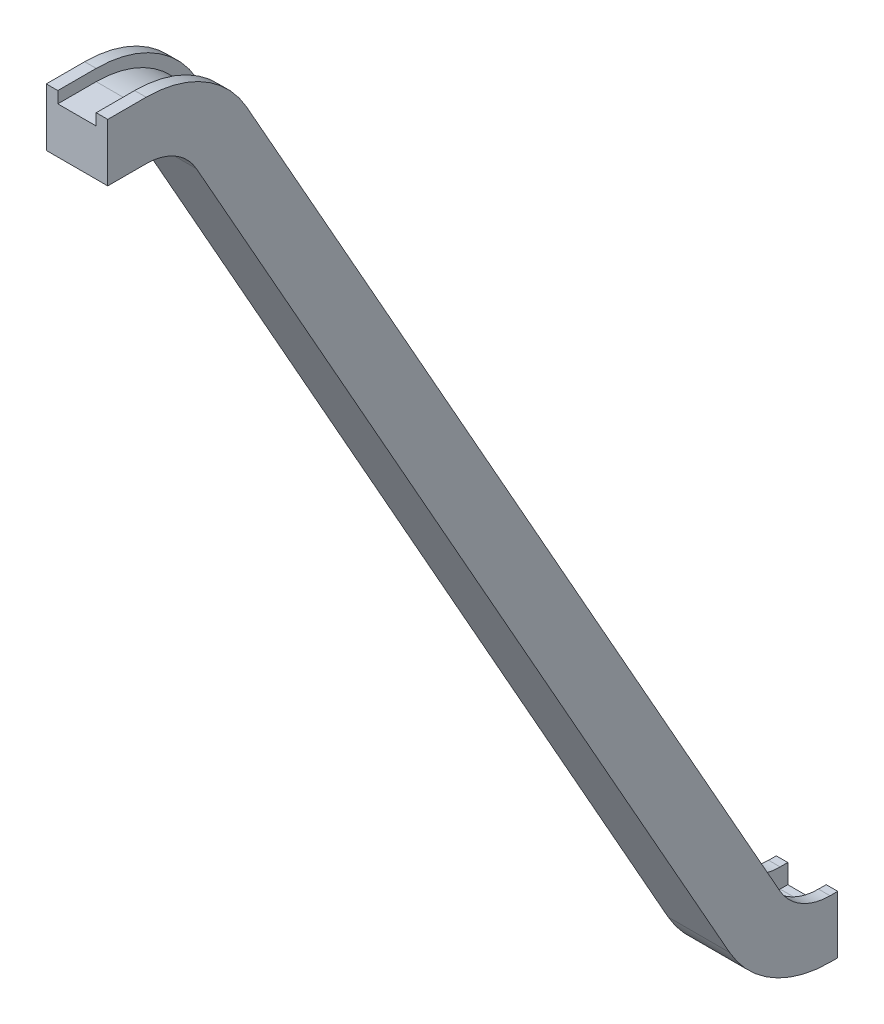
ISO-10303-21;
HEADER;
FILE_DESCRIPTION(('STEP AP214'),'2;1');
FILE_NAME('part.step','',(''),(''),'','','');
FILE_SCHEMA(('AUTOMOTIVE_DESIGN { 1 0 10303 214 1 1 1 1 }'));
ENDSEC;
DATA;
#1=APPLICATION_CONTEXT('core data for automotive mechanical design processes');
#2=APPLICATION_PROTOCOL_DEFINITION('international standard','automotive_design',2000,#1);
#3=PRODUCT_CONTEXT('',#1,'mechanical');
#4=PRODUCT('Part','Part','',(#3));
#5=PRODUCT_RELATED_PRODUCT_CATEGORY('part','',(#4));
#6=PRODUCT_DEFINITION_FORMATION('','',#4);
#7=PRODUCT_DEFINITION_CONTEXT('part definition',#1,'design');
#8=PRODUCT_DEFINITION('design','',#6,#7);
#9=PRODUCT_DEFINITION_SHAPE('','',#8);
#10=(LENGTH_UNIT() NAMED_UNIT(*) SI_UNIT(.MILLI.,.METRE.));
#11=(NAMED_UNIT(*) PLANE_ANGLE_UNIT() SI_UNIT($,.RADIAN.));
#12=(NAMED_UNIT(*) SI_UNIT($,.STERADIAN.) SOLID_ANGLE_UNIT());
#13=UNCERTAINTY_MEASURE_WITH_UNIT(LENGTH_MEASURE(1.E-05),#10,'distance_accuracy_value','');
#14=(GEOMETRIC_REPRESENTATION_CONTEXT(3) GLOBAL_UNCERTAINTY_ASSIGNED_CONTEXT((#13)) GLOBAL_UNIT_ASSIGNED_CONTEXT((#10,
#11,#12)) REPRESENTATION_CONTEXT('',''));
#15=CARTESIAN_POINT('',(0.,0.,0.));
#16=DIRECTION('',(0.,0.,1.));
#17=DIRECTION('',(1.,0.,0.));
#18=AXIS2_PLACEMENT_3D('',#15,#16,#17);
#19=CARTESIAN_POINT('',(16.,15.3965664492848,-27.2988300579903));
#20=DIRECTION('',(0.,0.491254052119881,-0.871016335251985));
#21=DIRECTION('',(0.,0.871016335251985,0.491254052119881));
#22=AXIS2_PLACEMENT_3D('',#19,#20,#21);
#23=PLANE('',#22);
#24=DIRECTION('',(-1.,0.,0.));
#25=VECTOR('',#24,1.);
#26=CARTESIAN_POINT('',(16.,-0.262378436403575,-36.1304900575595));
#27=LINE('',#26,#25);
#28=CARTESIAN_POINT('',(3.,-0.262378436403572,-36.1304900575595));
#29=VERTEX_POINT('',#28);
#30=CARTESIAN_POINT('',(0.,-0.262378436403575,-36.1304900575595));
#31=VERTEX_POINT('',#30);
#32=EDGE_CURVE('E56',#29,#31,#27,.T.);
#33=ORIENTED_EDGE('',*,*,#32,.F.);
#34=DIRECTION('',(0.,0.871016335251985,0.491254052119881));
#35=VECTOR('',#34,1.);
#36=CARTESIAN_POINT('',(3.,15.3965664492848,-27.2988300579903));
#37=LINE('',#36,#35);
#38=CARTESIAN_POINT('',(3.,-246.368810781798,-174.93475497122));
#39=VERTEX_POINT('',#38);
#40=EDGE_CURVE('E326',#39,#29,#37,.T.);
#41=ORIENTED_EDGE('',*,*,#40,.F.);
#42=DIRECTION('',(-1.,0.,0.));
#43=VECTOR('',#42,1.);
#44=CARTESIAN_POINT('',(16.,-246.368810781798,-174.93475497122));
#45=LINE('',#44,#43);
#46=CARTESIAN_POINT('',(0.,-246.368810781798,-174.93475497122));
#47=VERTEX_POINT('',#46);
#48=EDGE_CURVE('E118',#39,#47,#45,.T.);
#49=ORIENTED_EDGE('',*,*,#48,.T.);
#50=DIRECTION('',(0.,-0.871016335251985,-0.491254052119881));
#51=VECTOR('',#50,1.);
#52=CARTESIAN_POINT('',(0.,15.3965664492848,-27.2988300579903));
#53=LINE('',#52,#51);
#54=EDGE_CURVE('E194',#31,#47,#53,.T.);
#55=ORIENTED_EDGE('',*,*,#54,.F.);
#56=EDGE_LOOP('',(#33,#41,#49,#55));
#57=FACE_BOUND('',#56,.T.);
#58=ADVANCED_FACE('F47',(#57),#23,.T.);
#59=CARTESIAN_POINT('',(16.,-15.,-10.));
#60=DIRECTION('',(-1.,0.,0.));
#61=DIRECTION('',(0.,0.,1.));
#62=AXIS2_PLACEMENT_3D('',#59,#60,#61);
#63=CYLINDRICAL_SURFACE('',#62,30.);
#64=CARTESIAN_POINT('',(3.,-15.,-10.));
#65=DIRECTION('',(1.,0.,0.));
#66=DIRECTION('',(0.,0.,-1.));
#67=AXIS2_PLACEMENT_3D('',#64,#65,#66);
#68=CIRCLE('',#67,30.);
#69=CARTESIAN_POINT('',(3.,15.,-10.));
#70=VERTEX_POINT('',#69);
#71=EDGE_CURVE('E467',#29,#70,#68,.T.);
#72=ORIENTED_EDGE('',*,*,#71,.F.);
#73=ORIENTED_EDGE('',*,*,#32,.T.);
#74=CARTESIAN_POINT('',(0.,-15.,-10.));
#75=DIRECTION('',(1.,0.,0.));
#76=DIRECTION('',(0.,0.,-1.));
#77=AXIS2_PLACEMENT_3D('',#74,#75,#76);
#78=CIRCLE('',#77,30.);
#79=CARTESIAN_POINT('',(0.,15.,-10.));
#80=VERTEX_POINT('',#79);
#81=EDGE_CURVE('E197',#31,#80,#78,.T.);
#82=ORIENTED_EDGE('',*,*,#81,.T.);
#83=DIRECTION('',(-1.,0.,0.));
#84=VECTOR('',#83,1.);
#85=CARTESIAN_POINT('',(16.,15.,-10.));
#86=LINE('',#85,#84);
#87=EDGE_CURVE('E268',#70,#80,#86,.T.);
#88=ORIENTED_EDGE('',*,*,#87,.F.);
#89=EDGE_LOOP('',(#72,#73,#82,#88));
#90=FACE_BOUND('',#89,.T.);
#91=ADVANCED_FACE('F291',(#90),#63,.T.);
#92=CARTESIAN_POINT('',(16.,15.,0.));
#93=DIRECTION('',(0.,1.,0.));
#94=DIRECTION('',(0.,0.,1.));
#95=AXIS2_PLACEMENT_3D('',#92,#93,#94);
#96=PLANE('',#95);
#97=DIRECTION('',(-1.,0.,0.));
#98=VECTOR('',#97,1.);
#99=CARTESIAN_POINT('',(16.,15.,0.));
#100=LINE('',#99,#98);
#101=CARTESIAN_POINT('',(3.,15.,0.));
#102=VERTEX_POINT('',#101);
#103=CARTESIAN_POINT('',(0.,15.,0.));
#104=VERTEX_POINT('',#103);
#105=EDGE_CURVE('E264',#102,#104,#100,.T.);
#106=ORIENTED_EDGE('',*,*,#105,.F.);
#107=DIRECTION('',(0.,0.,1.));
#108=VECTOR('',#107,1.);
#109=CARTESIAN_POINT('',(3.,15.,0.));
#110=LINE('',#109,#108);
#111=EDGE_CURVE('E287',#70,#102,#110,.T.);
#112=ORIENTED_EDGE('',*,*,#111,.F.);
#113=ORIENTED_EDGE('',*,*,#87,.T.);
#114=DIRECTION('',(0.,0.,-1.));
#115=VECTOR('',#114,1.);
#116=CARTESIAN_POINT('',(0.,15.,0.));
#117=LINE('',#116,#115);
#118=EDGE_CURVE('E202',#104,#80,#117,.T.);
#119=ORIENTED_EDGE('',*,*,#118,.F.);
#120=EDGE_LOOP('',(#106,#112,#113,#119));
#121=FACE_BOUND('',#120,.T.);
#122=ADVANCED_FACE('F284',(#121),#96,.T.);
#123=CARTESIAN_POINT('',(16.,0.,0.));
#124=DIRECTION('',(0.,0.,1.));
#125=DIRECTION('',(0.,-1.,0.));
#126=AXIS2_PLACEMENT_3D('',#123,#124,#125);
#127=PLANE('',#126);
#128=DIRECTION('',(1.,0.,0.));
#129=VECTOR('',#128,1.);
#130=CARTESIAN_POINT('',(3.,12.,0.));
#131=LINE('',#130,#129);
#132=CARTESIAN_POINT('',(3.,12.,0.));
#133=VERTEX_POINT('',#132);
#134=CARTESIAN_POINT('',(13.,12.,0.));
#135=VERTEX_POINT('',#134);
#136=EDGE_CURVE('E411',#133,#135,#131,.T.);
#137=ORIENTED_EDGE('',*,*,#136,.F.);
#138=DIRECTION('',(0.,-1.,0.));
#139=VECTOR('',#138,1.);
#140=CARTESIAN_POINT('',(3.,0.,0.));
#141=LINE('',#140,#139);
#142=EDGE_CURVE('E305',#102,#133,#141,.T.);
#143=ORIENTED_EDGE('',*,*,#142,.F.);
#144=ORIENTED_EDGE('',*,*,#105,.T.);
#145=DIRECTION('',(0.,1.,0.));
#146=VECTOR('',#145,1.);
#147=CARTESIAN_POINT('',(0.,0.,0.));
#148=LINE('',#147,#146);
#149=CARTESIAN_POINT('',(0.,0.,0.));
#150=VERTEX_POINT('',#149);
#151=EDGE_CURVE('E206',#150,#104,#148,.T.);
#152=ORIENTED_EDGE('',*,*,#151,.F.);
#153=DIRECTION('',(-1.,0.,0.));
#154=VECTOR('',#153,1.);
#155=CARTESIAN_POINT('',(16.,0.,0.));
#156=LINE('',#155,#154);
#157=CARTESIAN_POINT('',(16.,0.,0.));
#158=VERTEX_POINT('',#157);
#159=EDGE_CURVE('E261',#158,#150,#156,.T.);
#160=ORIENTED_EDGE('',*,*,#159,.F.);
#161=DIRECTION('',(0.,1.,0.));
#162=VECTOR('',#161,1.);
#163=CARTESIAN_POINT('',(16.,0.,0.));
#164=LINE('',#163,#162);
#165=CARTESIAN_POINT('',(16.,15.,0.));
#166=VERTEX_POINT('',#165);
#167=EDGE_CURVE('E422',#158,#166,#164,.T.);
#168=ORIENTED_EDGE('',*,*,#167,.T.);
#169=CARTESIAN_POINT('',(13.,15.,0.));
#170=VERTEX_POINT('',#169);
#171=EDGE_CURVE('E265',#166,#170,#100,.T.);
#172=ORIENTED_EDGE('',*,*,#171,.T.);
#173=DIRECTION('',(0.,-1.,0.));
#174=VECTOR('',#173,1.);
#175=CARTESIAN_POINT('',(13.,0.,0.));
#176=LINE('',#175,#174);
#177=EDGE_CURVE('E482',#170,#135,#176,.T.);
#178=ORIENTED_EDGE('',*,*,#177,.T.);
#179=EDGE_LOOP('',(#137,#143,#144,#152,#160,#168,#172,#178));
#180=FACE_BOUND('',#179,.T.);
#181=ADVANCED_FACE('F299',(#180),#127,.T.);
#182=CARTESIAN_POINT('',(16.,0.,-190.));
#183=DIRECTION('',(0.,0.,1.));
#184=DIRECTION('',(1.,0.,0.));
#185=AXIS2_PLACEMENT_3D('',#182,#183,#184);
#186=PLANE('',#185);
#187=DIRECTION('',(0.,1.,0.));
#188=VECTOR('',#187,1.);
#189=CARTESIAN_POINT('',(3.,0.,-190.));
#190=LINE('',#189,#188);
#191=CARTESIAN_POINT('',(3.,-259.,-190.));
#192=VERTEX_POINT('',#191);
#193=CARTESIAN_POINT('',(3.,-254.,-190.));
#194=VERTEX_POINT('',#193);
#195=EDGE_CURVE('E443',#192,#194,#190,.T.);
#196=ORIENTED_EDGE('',*,*,#195,.F.);
#197=DIRECTION('',(1.,0.,0.));
#198=VECTOR('',#197,1.);
#199=CARTESIAN_POINT('',(3.,-259.,-190.));
#200=LINE('',#199,#198);
#201=CARTESIAN_POINT('',(13.,-259.,-190.));
#202=VERTEX_POINT('',#201);
#203=EDGE_CURVE('E198',#192,#202,#200,.T.);
#204=ORIENTED_EDGE('',*,*,#203,.T.);
#205=DIRECTION('',(0.,1.,0.));
#206=VECTOR('',#205,1.);
#207=CARTESIAN_POINT('',(13.,0.,-190.));
#208=LINE('',#207,#206);
#209=CARTESIAN_POINT('',(13.,-254.,-190.));
#210=VERTEX_POINT('',#209);
#211=EDGE_CURVE('E177',#202,#210,#208,.T.);
#212=ORIENTED_EDGE('',*,*,#211,.T.);
#213=DIRECTION('',(-1.,0.,0.));
#214=VECTOR('',#213,1.);
#215=CARTESIAN_POINT('',(16.,-254.,-190.));
#216=LINE('',#215,#214);
#217=CARTESIAN_POINT('',(16.,-254.,-190.));
#218=VERTEX_POINT('',#217);
#219=EDGE_CURVE('E171',#218,#210,#216,.T.);
#220=ORIENTED_EDGE('',*,*,#219,.F.);
#221=DIRECTION('',(0.,1.,0.));
#222=VECTOR('',#221,1.);
#223=CARTESIAN_POINT('',(16.,0.,-190.));
#224=LINE('',#223,#222);
#225=CARTESIAN_POINT('',(16.,-269.,-190.));
#226=VERTEX_POINT('',#225);
#227=EDGE_CURVE('E154',#226,#218,#224,.T.);
#228=ORIENTED_EDGE('',*,*,#227,.F.);
#229=DIRECTION('',(-1.,0.,0.));
#230=VECTOR('',#229,1.);
#231=CARTESIAN_POINT('',(16.,-269.,-190.));
#232=LINE('',#231,#230);
#233=CARTESIAN_POINT('',(0.,-269.,-190.));
#234=VERTEX_POINT('',#233);
#235=EDGE_CURVE('E181',#226,#234,#232,.T.);
#236=ORIENTED_EDGE('',*,*,#235,.T.);
#237=DIRECTION('',(0.,1.,0.));
#238=VECTOR('',#237,1.);
#239=CARTESIAN_POINT('',(0.,0.,-190.));
#240=LINE('',#239,#238);
#241=CARTESIAN_POINT('',(0.,-254.,-190.));
#242=VERTEX_POINT('',#241);
#243=EDGE_CURVE('E227',#234,#242,#240,.T.);
#244=ORIENTED_EDGE('',*,*,#243,.T.);
#245=EDGE_CURVE('E182',#194,#242,#216,.T.);
#246=ORIENTED_EDGE('',*,*,#245,.F.);
#247=EDGE_LOOP('',(#196,#204,#212,#220,#228,#236,#244,#246));
#248=FACE_BOUND('',#247,.T.);
#249=ADVANCED_FACE('F173',(#248),#186,.F.);
#250=CARTESIAN_POINT('',(16.,-254.000000000005,-7.04991620636979E-12));
#251=DIRECTION('',(0.,-1.,0.));
#252=DIRECTION('',(0.,0.,-1.));
#253=AXIS2_PLACEMENT_3D('',#250,#251,#252);
#254=PLANE('',#253);
#255=DIRECTION('',(0.,0.,1.));
#256=VECTOR('',#255,1.);
#257=CARTESIAN_POINT('',(3.,-254.000000000005,-7.04991620636979E-12));
#258=LINE('',#257,#256);
#259=CARTESIAN_POINT('',(3.,-254.,-188.));
#260=VERTEX_POINT('',#259);
#261=EDGE_CURVE('E440',#194,#260,#258,.T.);
#262=ORIENTED_EDGE('',*,*,#261,.F.);
#263=ORIENTED_EDGE('',*,*,#245,.T.);
#264=DIRECTION('',(0.,0.,1.));
#265=VECTOR('',#264,1.);
#266=CARTESIAN_POINT('',(0.,-254.000000000005,-7.04991620636979E-12));
#267=LINE('',#266,#265);
#268=CARTESIAN_POINT('',(0.,-254.,-188.));
#269=VERTEX_POINT('',#268);
#270=EDGE_CURVE('E231',#242,#269,#267,.T.);
#271=ORIENTED_EDGE('',*,*,#270,.T.);
#272=DIRECTION('',(-1.,0.,0.));
#273=VECTOR('',#272,1.);
#274=CARTESIAN_POINT('',(16.,-254.,-188.));
#275=LINE('',#274,#273);
#276=EDGE_CURVE('E242',#260,#269,#275,.T.);
#277=ORIENTED_EDGE('',*,*,#276,.F.);
#278=EDGE_LOOP('',(#262,#263,#271,#277));
#279=FACE_BOUND('',#278,.T.);
#280=ADVANCED_FACE('F321',(#279),#254,.F.);
#281=CARTESIAN_POINT('',(16.,-239.,-188.));
#282=DIRECTION('',(-1.,0.,0.));
#283=DIRECTION('',(0.,0.,1.));
#284=AXIS2_PLACEMENT_3D('',#281,#282,#283);
#285=CYLINDRICAL_SURFACE('',#284,15.0000000000001);
#286=ORIENTED_EDGE('',*,*,#48,.F.);
#287=CARTESIAN_POINT('',(3.,-239.,-188.));
#288=DIRECTION('',(1.,0.,0.));
#289=DIRECTION('',(0.,0.,-1.));
#290=AXIS2_PLACEMENT_3D('',#287,#288,#289);
#291=CIRCLE('',#290,15.0000000000001);
#292=EDGE_CURVE('E317',#260,#39,#291,.F.);
#293=ORIENTED_EDGE('',*,*,#292,.F.);
#294=ORIENTED_EDGE('',*,*,#276,.T.);
#295=CARTESIAN_POINT('',(0.,-239.,-188.));
#296=DIRECTION('',(1.,0.,0.));
#297=DIRECTION('',(0.,0.,-1.));
#298=AXIS2_PLACEMENT_3D('',#295,#296,#297);
#299=CIRCLE('',#298,15.0000000000001);
#300=EDGE_CURVE('E235',#47,#269,#299,.T.);
#301=ORIENTED_EDGE('',*,*,#300,.F.);
#302=EDGE_LOOP('',(#286,#293,#294,#301));
#303=FACE_BOUND('',#302,.T.);
#304=ADVANCED_FACE('F314',(#303),#285,.F.);
#305=DIRECTION('',(0.,0.871016335251985,0.491254052119881));
#306=VECTOR('',#305,1.);
#307=CARTESIAN_POINT('',(13.,15.3965664492848,-27.2988300579903));
#308=LINE('',#307,#306);
#309=CARTESIAN_POINT('',(13.,-246.368810781798,-174.93475497122));
#310=VERTEX_POINT('',#309);
#311=CARTESIAN_POINT('',(13.,-0.262378436403572,-36.1304900575595));
#312=VERTEX_POINT('',#311);
#313=EDGE_CURVE('E63',#310,#312,#308,.T.);
#314=ORIENTED_EDGE('',*,*,#313,.T.);
#315=CARTESIAN_POINT('',(16.,-0.262378436403575,-36.1304900575595));
#316=VERTEX_POINT('',#315);
#317=EDGE_CURVE('E11',#316,#312,#27,.T.);
#318=ORIENTED_EDGE('',*,*,#317,.F.);
#319=DIRECTION('',(0.,-0.871016335251985,-0.491254052119881));
#320=VECTOR('',#319,1.);
#321=CARTESIAN_POINT('',(16.,15.3965664492848,-27.2988300579903));
#322=LINE('',#321,#320);
#323=CARTESIAN_POINT('',(16.,-246.368810781798,-174.93475497122));
#324=VERTEX_POINT('',#323);
#325=EDGE_CURVE('E239',#316,#324,#322,.T.);
#326=ORIENTED_EDGE('',*,*,#325,.T.);
#327=EDGE_CURVE('E71',#324,#310,#45,.T.);
#328=ORIENTED_EDGE('',*,*,#327,.T.);
#329=EDGE_LOOP('',(#314,#318,#326,#328));
#330=FACE_BOUND('',#329,.T.);
#331=ADVANCED_FACE('F49',(#330),#23,.T.);
#332=ORIENTED_EDGE('',*,*,#317,.T.);
#333=CARTESIAN_POINT('',(13.,-15.,-10.));
#334=DIRECTION('',(1.,0.,0.));
#335=DIRECTION('',(0.,0.,-1.));
#336=AXIS2_PLACEMENT_3D('',#333,#334,#335);
#337=CIRCLE('',#336,30.);
#338=CARTESIAN_POINT('',(13.,15.,-10.));
#339=VERTEX_POINT('',#338);
#340=EDGE_CURVE('E475',#312,#339,#337,.T.);
#341=ORIENTED_EDGE('',*,*,#340,.T.);
#342=CARTESIAN_POINT('',(16.,15.,-10.));
#343=VERTEX_POINT('',#342);
#344=EDGE_CURVE('E269',#343,#339,#86,.T.);
#345=ORIENTED_EDGE('',*,*,#344,.F.);
#346=CARTESIAN_POINT('',(16.,-15.,-10.));
#347=DIRECTION('',(1.,0.,0.));
#348=DIRECTION('',(0.,0.,-1.));
#349=AXIS2_PLACEMENT_3D('',#346,#347,#348);
#350=CIRCLE('',#349,30.);
#351=EDGE_CURVE('E416',#316,#343,#350,.T.);
#352=ORIENTED_EDGE('',*,*,#351,.F.);
#353=EDGE_LOOP('',(#332,#341,#345,#352));
#354=FACE_BOUND('',#353,.T.);
#355=ADVANCED_FACE('F526',(#354),#63,.T.);
#356=DIRECTION('',(0.,0.,1.));
#357=VECTOR('',#356,1.);
#358=CARTESIAN_POINT('',(13.,15.,0.));
#359=LINE('',#358,#357);
#360=EDGE_CURVE('E479',#339,#170,#359,.T.);
#361=ORIENTED_EDGE('',*,*,#360,.T.);
#362=ORIENTED_EDGE('',*,*,#171,.F.);
#363=DIRECTION('',(0.,0.,-1.));
#364=VECTOR('',#363,1.);
#365=CARTESIAN_POINT('',(16.,15.,0.));
#366=LINE('',#365,#364);
#367=EDGE_CURVE('E419',#166,#343,#366,.T.);
#368=ORIENTED_EDGE('',*,*,#367,.T.);
#369=ORIENTED_EDGE('',*,*,#344,.T.);
#370=EDGE_LOOP('',(#361,#362,#368,#369));
#371=FACE_BOUND('',#370,.T.);
#372=ADVANCED_FACE('F524',(#371),#96,.T.);
#373=CARTESIAN_POINT('',(16.,0.,0.));
#374=DIRECTION('',(0.,1.,0.));
#375=DIRECTION('',(0.,0.,1.));
#376=AXIS2_PLACEMENT_3D('',#373,#374,#375);
#377=PLANE('',#376);
#378=DIRECTION('',(0.,0.,-1.));
#379=VECTOR('',#378,1.);
#380=CARTESIAN_POINT('',(0.,0.,0.));
#381=LINE('',#380,#379);
#382=CARTESIAN_POINT('',(0.,0.,-10.));
#383=VERTEX_POINT('',#382);
#384=EDGE_CURVE('E210',#150,#383,#381,.T.);
#385=ORIENTED_EDGE('',*,*,#384,.T.);
#386=DIRECTION('',(-1.,0.,0.));
#387=VECTOR('',#386,1.);
#388=CARTESIAN_POINT('',(16.,0.,-10.));
#389=LINE('',#388,#387);
#390=CARTESIAN_POINT('',(16.,0.,-10.));
#391=VERTEX_POINT('',#390);
#392=EDGE_CURVE('E258',#391,#383,#389,.T.);
#393=ORIENTED_EDGE('',*,*,#392,.F.);
#394=DIRECTION('',(0.,0.,-1.));
#395=VECTOR('',#394,1.);
#396=CARTESIAN_POINT('',(16.,0.,0.));
#397=LINE('',#396,#395);
#398=EDGE_CURVE('E425',#158,#391,#397,.T.);
#399=ORIENTED_EDGE('',*,*,#398,.F.);
#400=ORIENTED_EDGE('',*,*,#159,.T.);
#401=EDGE_LOOP('',(#385,#393,#399,#400));
#402=FACE_BOUND('',#401,.T.);
#403=ADVANCED_FACE('F552',(#402),#377,.F.);
#404=CARTESIAN_POINT('',(16.,-15.,-10.));
#405=DIRECTION('',(-1.,0.,0.));
#406=DIRECTION('',(0.,0.,1.));
#407=AXIS2_PLACEMENT_3D('',#404,#405,#406);
#408=CYLINDRICAL_SURFACE('',#407,15.);
#409=CARTESIAN_POINT('',(0.,-15.,-10.));
#410=DIRECTION('',(1.,0.,0.));
#411=DIRECTION('',(0.,0.,-1.));
#412=AXIS2_PLACEMENT_3D('',#409,#410,#411);
#413=CIRCLE('',#412,15.);
#414=CARTESIAN_POINT('',(0.,-7.63118921820179,-23.0652450287798));
#415=VERTEX_POINT('',#414);
#416=EDGE_CURVE('E214',#415,#383,#413,.T.);
#417=ORIENTED_EDGE('',*,*,#416,.F.);
#418=DIRECTION('',(-1.,0.,0.));
#419=VECTOR('',#418,1.);
#420=CARTESIAN_POINT('',(16.,-7.63118921820179,-23.0652450287798));
#421=LINE('',#420,#419);
#422=CARTESIAN_POINT('',(16.,-7.63118921820179,-23.0652450287798));
#423=VERTEX_POINT('',#422);
#424=EDGE_CURVE('E255',#423,#415,#421,.T.);
#425=ORIENTED_EDGE('',*,*,#424,.F.);
#426=CARTESIAN_POINT('',(16.,-15.,-10.));
#427=DIRECTION('',(1.,0.,0.));
#428=DIRECTION('',(0.,0.,-1.));
#429=AXIS2_PLACEMENT_3D('',#426,#427,#428);
#430=CIRCLE('',#429,15.);
#431=EDGE_CURVE('E428',#423,#391,#430,.T.);
#432=ORIENTED_EDGE('',*,*,#431,.T.);
#433=ORIENTED_EDGE('',*,*,#392,.T.);
#434=EDGE_LOOP('',(#417,#425,#432,#433));
#435=FACE_BOUND('',#434,.T.);
#436=ADVANCED_FACE('F559',(#435),#408,.F.);
#437=CARTESIAN_POINT('',(16.,8.02775566748663,-14.2335850292106));
#438=DIRECTION('',(0.,0.491254052119881,-0.871016335251985));
#439=DIRECTION('',(0.,0.871016335251985,0.491254052119881));
#440=AXIS2_PLACEMENT_3D('',#437,#438,#439);
#441=PLANE('',#440);
#442=DIRECTION('',(0.,-0.871016335251985,-0.491254052119881));
#443=VECTOR('',#442,1.);
#444=CARTESIAN_POINT('',(0.,8.02775566748663,-14.2335850292106));
#445=LINE('',#444,#443);
#446=CARTESIAN_POINT('',(0.,-253.737621563596,-161.86950994244));
#447=VERTEX_POINT('',#446);
#448=EDGE_CURVE('E218',#415,#447,#445,.T.);
#449=ORIENTED_EDGE('',*,*,#448,.T.);
#450=DIRECTION('',(-1.,0.,0.));
#451=VECTOR('',#450,1.);
#452=CARTESIAN_POINT('',(16.,-253.737621563596,-161.86950994244));
#453=LINE('',#452,#451);
#454=CARTESIAN_POINT('',(16.,-253.737621563596,-161.86950994244));
#455=VERTEX_POINT('',#454);
#456=EDGE_CURVE('E251',#455,#447,#453,.T.);
#457=ORIENTED_EDGE('',*,*,#456,.F.);
#458=DIRECTION('',(0.,-0.871016335251985,-0.491254052119881));
#459=VECTOR('',#458,1.);
#460=CARTESIAN_POINT('',(16.,8.02775566748663,-14.2335850292106));
#461=LINE('',#460,#459);
#462=EDGE_CURVE('E432',#423,#455,#461,.T.);
#463=ORIENTED_EDGE('',*,*,#462,.F.);
#464=ORIENTED_EDGE('',*,*,#424,.T.);
#465=EDGE_LOOP('',(#449,#457,#463,#464));
#466=FACE_BOUND('',#465,.T.);
#467=ADVANCED_FACE('F563',(#466),#441,.F.);
#468=CARTESIAN_POINT('',(16.,-239.,-188.));
#469=DIRECTION('',(-1.,0.,0.));
#470=DIRECTION('',(0.,0.,1.));
#471=AXIS2_PLACEMENT_3D('',#468,#469,#470);
#472=CYLINDRICAL_SURFACE('',#471,30.);
#473=CARTESIAN_POINT('',(0.,-239.,-188.));
#474=DIRECTION('',(1.,0.,0.));
#475=DIRECTION('',(0.,0.,-1.));
#476=AXIS2_PLACEMENT_3D('',#473,#474,#475);
#477=CIRCLE('',#476,30.);
#478=CARTESIAN_POINT('',(0.,-269.,-188.));
#479=VERTEX_POINT('',#478);
#480=EDGE_CURVE('E221',#447,#479,#477,.T.);
#481=ORIENTED_EDGE('',*,*,#480,.T.);
#482=DIRECTION('',(-1.,0.,0.));
#483=VECTOR('',#482,1.);
#484=CARTESIAN_POINT('',(16.,-269.,-188.));
#485=LINE('',#484,#483);
#486=CARTESIAN_POINT('',(16.,-269.,-188.));
#487=VERTEX_POINT('',#486);
#488=EDGE_CURVE('E247',#487,#479,#485,.T.);
#489=ORIENTED_EDGE('',*,*,#488,.F.);
#490=CARTESIAN_POINT('',(16.,-239.,-188.));
#491=DIRECTION('',(1.,0.,0.));
#492=DIRECTION('',(0.,0.,-1.));
#493=AXIS2_PLACEMENT_3D('',#490,#491,#492);
#494=CIRCLE('',#493,30.);
#495=EDGE_CURVE('E435',#455,#487,#494,.T.);
#496=ORIENTED_EDGE('',*,*,#495,.F.);
#497=ORIENTED_EDGE('',*,*,#456,.T.);
#498=EDGE_LOOP('',(#481,#489,#496,#497));
#499=FACE_BOUND('',#498,.T.);
#500=ADVANCED_FACE('F567',(#499),#472,.T.);
#501=CARTESIAN_POINT('',(16.,-269.,0.));
#502=DIRECTION('',(0.,1.,0.));
#503=DIRECTION('',(0.,0.,1.));
#504=AXIS2_PLACEMENT_3D('',#501,#502,#503);
#505=PLANE('',#504);
#506=DIRECTION('',(0.,0.,-1.));
#507=VECTOR('',#506,1.);
#508=CARTESIAN_POINT('',(0.,-269.,0.));
#509=LINE('',#508,#507);
#510=EDGE_CURVE('E224',#479,#234,#509,.T.);
#511=ORIENTED_EDGE('',*,*,#510,.T.);
#512=ORIENTED_EDGE('',*,*,#235,.F.);
#513=DIRECTION('',(0.,0.,-1.));
#514=VECTOR('',#513,1.);
#515=CARTESIAN_POINT('',(16.,-269.,0.));
#516=LINE('',#515,#514);
#517=EDGE_CURVE('E163',#487,#226,#516,.T.);
#518=ORIENTED_EDGE('',*,*,#517,.F.);
#519=ORIENTED_EDGE('',*,*,#488,.T.);
#520=EDGE_LOOP('',(#511,#512,#518,#519));
#521=FACE_BOUND('',#520,.T.);
#522=ADVANCED_FACE('F536',(#521),#505,.F.);
#523=ORIENTED_EDGE('',*,*,#219,.T.);
#524=DIRECTION('',(0.,0.,1.));
#525=VECTOR('',#524,1.);
#526=CARTESIAN_POINT('',(13.,-254.000000000005,-7.04991620636979E-12));
#527=LINE('',#526,#525);
#528=CARTESIAN_POINT('',(13.,-254.,-188.));
#529=VERTEX_POINT('',#528);
#530=EDGE_CURVE('E381',#210,#529,#527,.T.);
#531=ORIENTED_EDGE('',*,*,#530,.T.);
#532=CARTESIAN_POINT('',(16.,-254.,-188.));
#533=VERTEX_POINT('',#532);
#534=EDGE_CURVE('E186',#533,#529,#275,.T.);
#535=ORIENTED_EDGE('',*,*,#534,.F.);
#536=DIRECTION('',(0.,0.,1.));
#537=VECTOR('',#536,1.);
#538=CARTESIAN_POINT('',(16.,-254.000000000005,-7.04991620636979E-12));
#539=LINE('',#538,#537);
#540=EDGE_CURVE('E160',#218,#533,#539,.T.);
#541=ORIENTED_EDGE('',*,*,#540,.F.);
#542=EDGE_LOOP('',(#523,#531,#535,#541));
#543=FACE_BOUND('',#542,.T.);
#544=ADVANCED_FACE('F184',(#543),#254,.F.);
#545=CARTESIAN_POINT('',(13.,-239.,-188.));
#546=DIRECTION('',(1.,0.,0.));
#547=DIRECTION('',(0.,0.,-1.));
#548=AXIS2_PLACEMENT_3D('',#545,#546,#547);
#549=CIRCLE('',#548,15.0000000000001);
#550=EDGE_CURVE('E385',#529,#310,#549,.F.);
#551=ORIENTED_EDGE('',*,*,#550,.T.);
#552=ORIENTED_EDGE('',*,*,#327,.F.);
#553=CARTESIAN_POINT('',(16.,-239.,-188.));
#554=DIRECTION('',(1.,0.,0.));
#555=DIRECTION('',(0.,0.,-1.));
#556=AXIS2_PLACEMENT_3D('',#553,#554,#555);
#557=CIRCLE('',#556,15.0000000000001);
#558=EDGE_CURVE('E188',#324,#533,#557,.T.);
#559=ORIENTED_EDGE('',*,*,#558,.T.);
#560=ORIENTED_EDGE('',*,*,#534,.T.);
#561=EDGE_LOOP('',(#551,#552,#559,#560));
#562=FACE_BOUND('',#561,.T.);
#563=ADVANCED_FACE('F527',(#562),#285,.F.);
#564=CARTESIAN_POINT('',(16.,0.,0.));
#565=DIRECTION('',(1.,0.,0.));
#566=DIRECTION('',(0.,0.,-1.));
#567=AXIS2_PLACEMENT_3D('',#564,#565,#566);
#568=PLANE('',#567);
#569=ORIENTED_EDGE('',*,*,#325,.F.);
#570=ORIENTED_EDGE('',*,*,#351,.T.);
#571=ORIENTED_EDGE('',*,*,#367,.F.);
#572=ORIENTED_EDGE('',*,*,#167,.F.);
#573=ORIENTED_EDGE('',*,*,#398,.T.);
#574=ORIENTED_EDGE('',*,*,#431,.F.);
#575=ORIENTED_EDGE('',*,*,#462,.T.);
#576=ORIENTED_EDGE('',*,*,#495,.T.);
#577=ORIENTED_EDGE('',*,*,#517,.T.);
#578=ORIENTED_EDGE('',*,*,#227,.T.);
#579=ORIENTED_EDGE('',*,*,#540,.T.);
#580=ORIENTED_EDGE('',*,*,#558,.F.);
#581=EDGE_LOOP('',(#569,#570,#571,#572,#573,#574,#575,#576,#577,#578,#579,#580));
#582=FACE_BOUND('',#581,.T.);
#583=ADVANCED_FACE('F157',(#582),#568,.T.);
#584=CARTESIAN_POINT('',(0.,0.,0.));
#585=DIRECTION('',(1.,0.,0.));
#586=DIRECTION('',(0.,0.,-1.));
#587=AXIS2_PLACEMENT_3D('',#584,#585,#586);
#588=PLANE('',#587);
#589=ORIENTED_EDGE('',*,*,#54,.T.);
#590=ORIENTED_EDGE('',*,*,#300,.T.);
#591=ORIENTED_EDGE('',*,*,#270,.F.);
#592=ORIENTED_EDGE('',*,*,#243,.F.);
#593=ORIENTED_EDGE('',*,*,#510,.F.);
#594=ORIENTED_EDGE('',*,*,#480,.F.);
#595=ORIENTED_EDGE('',*,*,#448,.F.);
#596=ORIENTED_EDGE('',*,*,#416,.T.);
#597=ORIENTED_EDGE('',*,*,#384,.F.);
#598=ORIENTED_EDGE('',*,*,#151,.T.);
#599=ORIENTED_EDGE('',*,*,#118,.T.);
#600=ORIENTED_EDGE('',*,*,#81,.F.);
#601=EDGE_LOOP('',(#589,#590,#591,#592,#593,#594,#595,#596,#597,#598,#599,#600));
#602=FACE_BOUND('',#601,.T.);
#603=ADVANCED_FACE('F294',(#602),#588,.F.);
#604=CARTESIAN_POINT('',(3.,-259.,0.));
#605=DIRECTION('',(0.,-1.,0.));
#606=DIRECTION('',(0.,0.,-1.));
#607=AXIS2_PLACEMENT_3D('',#604,#605,#606);
#608=PLANE('',#607);
#609=DIRECTION('',(0.,0.,-1.));
#610=VECTOR('',#609,1.);
#611=CARTESIAN_POINT('',(13.,-259.,0.));
#612=LINE('',#611,#610);
#613=CARTESIAN_POINT('',(13.,-259.,-188.));
#614=VERTEX_POINT('',#613);
#615=EDGE_CURVE('E391',#614,#202,#612,.T.);
#616=ORIENTED_EDGE('',*,*,#615,.T.);
#617=ORIENTED_EDGE('',*,*,#203,.F.);
#618=DIRECTION('',(0.,0.,-1.));
#619=VECTOR('',#618,1.);
#620=CARTESIAN_POINT('',(3.,-259.,0.));
#621=LINE('',#620,#619);
#622=CARTESIAN_POINT('',(3.,-259.,-188.));
#623=VERTEX_POINT('',#622);
#624=EDGE_CURVE('E446',#623,#192,#621,.T.);
#625=ORIENTED_EDGE('',*,*,#624,.F.);
#626=DIRECTION('',(1.,0.,0.));
#627=VECTOR('',#626,1.);
#628=CARTESIAN_POINT('',(3.,-259.,-188.));
#629=LINE('',#628,#627);
#630=EDGE_CURVE('E397',#623,#614,#629,.T.);
#631=ORIENTED_EDGE('',*,*,#630,.T.);
#632=EDGE_LOOP('',(#616,#617,#625,#631));
#633=FACE_BOUND('',#632,.T.);
#634=ADVANCED_FACE('F501',(#633),#608,.F.);
#635=CARTESIAN_POINT('',(3.,-239.,-188.));
#636=DIRECTION('',(1.,0.,0.));
#637=DIRECTION('',(0.,0.,-1.));
#638=AXIS2_PLACEMENT_3D('',#635,#636,#637);
#639=CYLINDRICAL_SURFACE('',#638,20.);
#640=CARTESIAN_POINT('',(13.,-239.,-188.));
#641=DIRECTION('',(1.,0.,0.));
#642=DIRECTION('',(0.,0.,-1.));
#643=AXIS2_PLACEMENT_3D('',#640,#641,#642);
#644=CIRCLE('',#643,20.);
#645=CARTESIAN_POINT('',(13.,-248.701457505611,-170.510525386198));
#646=VERTEX_POINT('',#645);
#647=EDGE_CURVE('E496',#646,#614,#644,.T.);
#648=ORIENTED_EDGE('',*,*,#647,.T.);
#649=ORIENTED_EDGE('',*,*,#630,.F.);
#650=CARTESIAN_POINT('',(3.,-239.,-188.));
#651=DIRECTION('',(1.,0.,0.));
#652=DIRECTION('',(0.,0.,-1.));
#653=AXIS2_PLACEMENT_3D('',#650,#651,#652);
#654=CIRCLE('',#653,20.);
#655=CARTESIAN_POINT('',(3.,-248.701457505611,-170.510525386198));
#656=VERTEX_POINT('',#655);
#657=EDGE_CURVE('E450',#656,#623,#654,.T.);
#658=ORIENTED_EDGE('',*,*,#657,.F.);
#659=DIRECTION('',(1.,0.,0.));
#660=VECTOR('',#659,1.);
#661=CARTESIAN_POINT('',(3.,-248.701457505611,-170.510525386198));
#662=LINE('',#661,#660);
#663=EDGE_CURVE('E400',#656,#646,#662,.T.);
#664=ORIENTED_EDGE('',*,*,#663,.T.);
#665=EDGE_LOOP('',(#648,#649,#658,#664));
#666=FACE_BOUND('',#665,.T.);
#667=ADVANCED_FACE('F509',(#666),#639,.F.);
#668=CARTESIAN_POINT('',(3.,13.809367086612,-24.8950814817565));
#669=DIRECTION('',(0.,0.485072875280533,-0.874473730690109));
#670=DIRECTION('',(0.,0.874473730690109,0.485072875280533));
#671=AXIS2_PLACEMENT_3D('',#668,#669,#670);
#672=PLANE('',#671);
#673=DIRECTION('',(0.,0.874473730690109,0.485072875280533));
#674=VECTOR('',#673,1.);
#675=CARTESIAN_POINT('',(13.,13.809367086612,-24.8950814817565));
#676=LINE('',#675,#674);
#677=CARTESIAN_POINT('',(13.,-1.90303236742563,-33.6107907286329));
#678=VERTEX_POINT('',#677);
#679=EDGE_CURVE('E493',#646,#678,#676,.T.);
#680=ORIENTED_EDGE('',*,*,#679,.F.);
#681=ORIENTED_EDGE('',*,*,#663,.F.);
#682=DIRECTION('',(0.,0.874473730690109,0.485072875280533));
#683=VECTOR('',#682,1.);
#684=CARTESIAN_POINT('',(3.,13.809367086612,-24.8950814817565));
#685=LINE('',#684,#683);
#686=CARTESIAN_POINT('',(3.,-1.90303236742563,-33.6107907286329));
#687=VERTEX_POINT('',#686);
#688=EDGE_CURVE('E454',#656,#687,#685,.T.);
#689=ORIENTED_EDGE('',*,*,#688,.T.);
#690=DIRECTION('',(1.,0.,0.));
#691=VECTOR('',#690,1.);
#692=CARTESIAN_POINT('',(3.,-1.90303236742563,-33.6107907286329));
#693=LINE('',#692,#691);
#694=EDGE_CURVE('E403',#687,#678,#693,.T.);
#695=ORIENTED_EDGE('',*,*,#694,.T.);
#696=EDGE_LOOP('',(#680,#681,#689,#695));
#697=FACE_BOUND('',#696,.T.);
#698=ADVANCED_FACE('F514',(#697),#672,.T.);
#699=CARTESIAN_POINT('',(3.,-15.,-10.));
#700=DIRECTION('',(1.,0.,0.));
#701=DIRECTION('',(0.,0.,-1.));
#702=AXIS2_PLACEMENT_3D('',#699,#700,#701);
#703=CYLINDRICAL_SURFACE('',#702,27.);
#704=CARTESIAN_POINT('',(13.,-15.,-10.));
#705=DIRECTION('',(1.,0.,0.));
#706=DIRECTION('',(0.,0.,-1.));
#707=AXIS2_PLACEMENT_3D('',#704,#705,#706);
#708=CIRCLE('',#707,27.);
#709=CARTESIAN_POINT('',(13.,12.,-10.));
#710=VERTEX_POINT('',#709);
#711=EDGE_CURVE('E490',#678,#710,#708,.T.);
#712=ORIENTED_EDGE('',*,*,#711,.F.);
#713=ORIENTED_EDGE('',*,*,#694,.F.);
#714=CARTESIAN_POINT('',(3.,-15.,-10.));
#715=DIRECTION('',(1.,0.,0.));
#716=DIRECTION('',(0.,0.,-1.));
#717=AXIS2_PLACEMENT_3D('',#714,#715,#716);
#718=CIRCLE('',#717,27.);
#719=CARTESIAN_POINT('',(3.,12.,-10.));
#720=VERTEX_POINT('',#719);
#721=EDGE_CURVE('E457',#687,#720,#718,.T.);
#722=ORIENTED_EDGE('',*,*,#721,.T.);
#723=DIRECTION('',(1.,0.,0.));
#724=VECTOR('',#723,1.);
#725=CARTESIAN_POINT('',(3.,12.,-10.));
#726=LINE('',#725,#724);
#727=EDGE_CURVE('E407',#720,#710,#726,.T.);
#728=ORIENTED_EDGE('',*,*,#727,.T.);
#729=EDGE_LOOP('',(#712,#713,#722,#728));
#730=FACE_BOUND('',#729,.T.);
#731=ADVANCED_FACE('F516',(#730),#703,.T.);
#732=CARTESIAN_POINT('',(3.,12.,0.));
#733=DIRECTION('',(0.,1.,0.));
#734=DIRECTION('',(0.,0.,1.));
#735=AXIS2_PLACEMENT_3D('',#732,#733,#734);
#736=PLANE('',#735);
#737=DIRECTION('',(0.,0.,1.));
#738=VECTOR('',#737,1.);
#739=CARTESIAN_POINT('',(13.,12.,0.));
#740=LINE('',#739,#738);
#741=EDGE_CURVE('E486',#710,#135,#740,.T.);
#742=ORIENTED_EDGE('',*,*,#741,.F.);
#743=ORIENTED_EDGE('',*,*,#727,.F.);
#744=DIRECTION('',(0.,0.,1.));
#745=VECTOR('',#744,1.);
#746=CARTESIAN_POINT('',(3.,12.,0.));
#747=LINE('',#746,#745);
#748=EDGE_CURVE('E460',#720,#133,#747,.T.);
#749=ORIENTED_EDGE('',*,*,#748,.T.);
#750=ORIENTED_EDGE('',*,*,#136,.T.);
#751=EDGE_LOOP('',(#742,#743,#749,#750));
#752=FACE_BOUND('',#751,.T.);
#753=ADVANCED_FACE('F521',(#752),#736,.T.);
#754=CARTESIAN_POINT('',(3.,0.,0.));
#755=DIRECTION('',(1.,0.,0.));
#756=DIRECTION('',(0.,0.,-1.));
#757=AXIS2_PLACEMENT_3D('',#754,#755,#756);
#758=PLANE('',#757);
#759=ORIENTED_EDGE('',*,*,#40,.T.);
#760=ORIENTED_EDGE('',*,*,#71,.T.);
#761=ORIENTED_EDGE('',*,*,#111,.T.);
#762=ORIENTED_EDGE('',*,*,#142,.T.);
#763=ORIENTED_EDGE('',*,*,#748,.F.);
#764=ORIENTED_EDGE('',*,*,#721,.F.);
#765=ORIENTED_EDGE('',*,*,#688,.F.);
#766=ORIENTED_EDGE('',*,*,#657,.T.);
#767=ORIENTED_EDGE('',*,*,#624,.T.);
#768=ORIENTED_EDGE('',*,*,#195,.T.);
#769=ORIENTED_EDGE('',*,*,#261,.T.);
#770=ORIENTED_EDGE('',*,*,#292,.T.);
#771=EDGE_LOOP('',(#759,#760,#761,#762,#763,#764,#765,#766,#767,#768,#769,#770));
#772=FACE_BOUND('',#771,.T.);
#773=ADVANCED_FACE('F504',(#772),#758,.T.);
#774=CARTESIAN_POINT('',(13.,0.,0.));
#775=DIRECTION('',(1.,0.,0.));
#776=DIRECTION('',(0.,0.,-1.));
#777=AXIS2_PLACEMENT_3D('',#774,#775,#776);
#778=PLANE('',#777);
#779=ORIENTED_EDGE('',*,*,#313,.F.);
#780=ORIENTED_EDGE('',*,*,#550,.F.);
#781=ORIENTED_EDGE('',*,*,#530,.F.);
#782=ORIENTED_EDGE('',*,*,#211,.F.);
#783=ORIENTED_EDGE('',*,*,#615,.F.);
#784=ORIENTED_EDGE('',*,*,#647,.F.);
#785=ORIENTED_EDGE('',*,*,#679,.T.);
#786=ORIENTED_EDGE('',*,*,#711,.T.);
#787=ORIENTED_EDGE('',*,*,#741,.T.);
#788=ORIENTED_EDGE('',*,*,#177,.F.);
#789=ORIENTED_EDGE('',*,*,#360,.F.);
#790=ORIENTED_EDGE('',*,*,#340,.F.);
#791=EDGE_LOOP('',(#779,#780,#781,#782,#783,#784,#785,#786,#787,#788,#789,#790));
#792=FACE_BOUND('',#791,.T.);
#793=ADVANCED_FACE('F382',(#792),#778,.F.);
#794=CLOSED_SHELL('',(#58,#91,#122,#181,#249,#280,#304,#331,#355,#372,#403,#436,#467,#500,#522,
#544,#563,#583,#603,#634,#667,#698,#731,#753,#773,#793));
#795=MANIFOLD_SOLID_BREP('B2',#794);
#796=ADVANCED_BREP_SHAPE_REPRESENTATION('',(#18,#795),#14);
#797=SHAPE_DEFINITION_REPRESENTATION(#9,#796);
ENDSEC;
END-ISO-10303-21;
